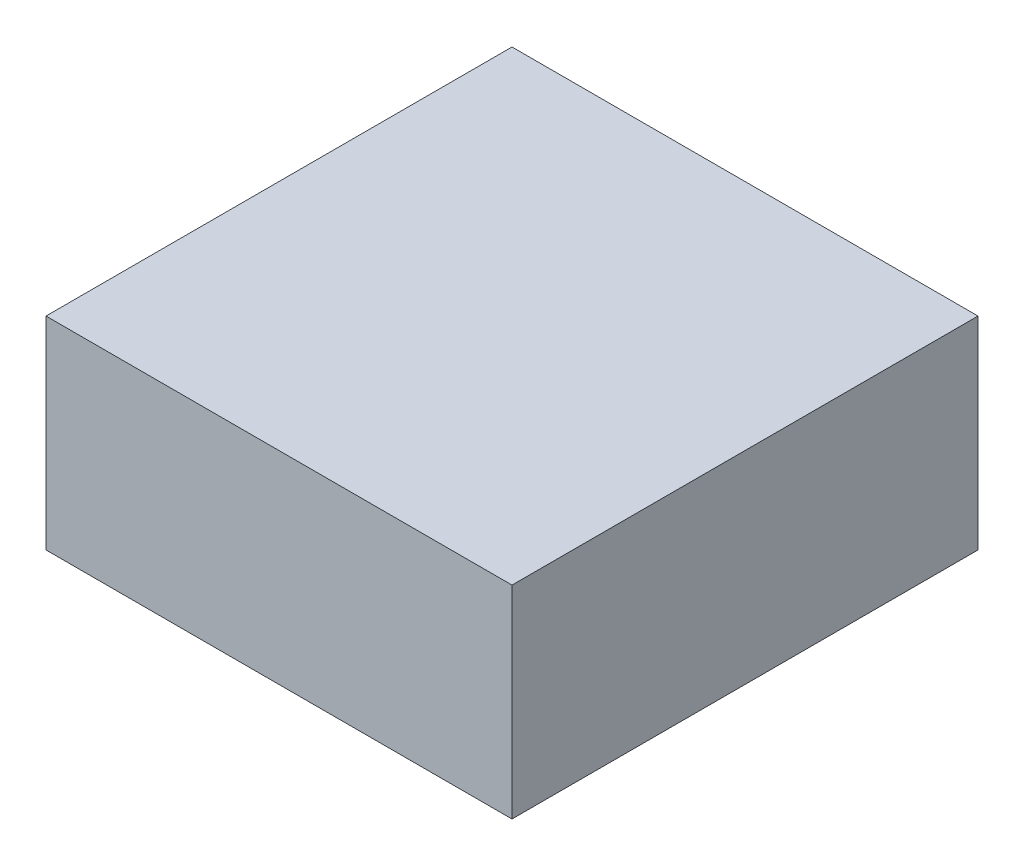
ISO-10303-21;
HEADER;
FILE_DESCRIPTION(('STEP AP214'),'2;1');
FILE_NAME('part.step','',(''),(''),'','','');
FILE_SCHEMA(('AUTOMOTIVE_DESIGN { 1 0 10303 214 1 1 1 1 }'));
ENDSEC;
DATA;
#1=APPLICATION_CONTEXT('core data for automotive mechanical design processes');
#2=APPLICATION_PROTOCOL_DEFINITION('international standard','automotive_design',2000,#1);
#3=PRODUCT_CONTEXT('',#1,'mechanical');
#4=PRODUCT('Part','Part','',(#3));
#5=PRODUCT_RELATED_PRODUCT_CATEGORY('part','',(#4));
#6=PRODUCT_DEFINITION_FORMATION('','',#4);
#7=PRODUCT_DEFINITION_CONTEXT('part definition',#1,'design');
#8=PRODUCT_DEFINITION('design','',#6,#7);
#9=PRODUCT_DEFINITION_SHAPE('','',#8);
#10=(LENGTH_UNIT() NAMED_UNIT(*) SI_UNIT(.MILLI.,.METRE.));
#11=(NAMED_UNIT(*) PLANE_ANGLE_UNIT() SI_UNIT($,.RADIAN.));
#12=(NAMED_UNIT(*) SI_UNIT($,.STERADIAN.) SOLID_ANGLE_UNIT());
#13=UNCERTAINTY_MEASURE_WITH_UNIT(LENGTH_MEASURE(1.E-05),#10,'distance_accuracy_value','');
#14=(GEOMETRIC_REPRESENTATION_CONTEXT(3) GLOBAL_UNCERTAINTY_ASSIGNED_CONTEXT((#13)) GLOBAL_UNIT_ASSIGNED_CONTEXT((#10,
#11,#12)) REPRESENTATION_CONTEXT('',''));
#15=CARTESIAN_POINT('',(0.,0.,0.));
#16=DIRECTION('',(0.,0.,1.));
#17=DIRECTION('',(1.,0.,0.));
#18=AXIS2_PLACEMENT_3D('',#15,#16,#17);
#19=CARTESIAN_POINT('',(115.,100.,-115.));
#20=DIRECTION('',(-1.,0.,0.));
#21=DIRECTION('',(0.,0.,1.));
#22=AXIS2_PLACEMENT_3D('',#19,#20,#21);
#23=PLANE('',#22);
#24=DIRECTION('',(0.,0.,-1.));
#25=VECTOR('',#24,1.);
#26=CARTESIAN_POINT('',(115.,0.,-115.));
#27=LINE('',#26,#25);
#28=CARTESIAN_POINT('',(115.,0.,115.));
#29=VERTEX_POINT('',#28);
#30=CARTESIAN_POINT('',(115.,0.,-115.));
#31=VERTEX_POINT('',#30);
#32=EDGE_CURVE('E107',#29,#31,#27,.T.);
#33=ORIENTED_EDGE('',*,*,#32,.T.);
#34=DIRECTION('',(0.,-1.,0.));
#35=VECTOR('',#34,1.);
#36=CARTESIAN_POINT('',(115.,100.,-115.));
#37=LINE('',#36,#35);
#38=CARTESIAN_POINT('',(115.,100.,-115.));
#39=VERTEX_POINT('',#38);
#40=EDGE_CURVE('E11',#39,#31,#37,.T.);
#41=ORIENTED_EDGE('',*,*,#40,.F.);
#42=DIRECTION('',(0.,0.,-1.));
#43=VECTOR('',#42,1.);
#44=CARTESIAN_POINT('',(115.,100.,-115.));
#45=LINE('',#44,#43);
#46=CARTESIAN_POINT('',(115.,100.,115.));
#47=VERTEX_POINT('',#46);
#48=EDGE_CURVE('E91',#47,#39,#45,.T.);
#49=ORIENTED_EDGE('',*,*,#48,.F.);
#50=DIRECTION('',(0.,-1.,0.));
#51=VECTOR('',#50,1.);
#52=CARTESIAN_POINT('',(115.,100.,115.));
#53=LINE('',#52,#51);
#54=EDGE_CURVE('E103',#47,#29,#53,.T.);
#55=ORIENTED_EDGE('',*,*,#54,.T.);
#56=EDGE_LOOP('',(#33,#41,#49,#55));
#57=FACE_BOUND('',#56,.T.);
#58=ADVANCED_FACE('F39',(#57),#23,.F.);
#59=CARTESIAN_POINT('',(-115.,100.,-115.));
#60=DIRECTION('',(0.,0.,1.));
#61=DIRECTION('',(1.,0.,0.));
#62=AXIS2_PLACEMENT_3D('',#59,#60,#61);
#63=PLANE('',#62);
#64=DIRECTION('',(-1.,0.,0.));
#65=VECTOR('',#64,1.);
#66=CARTESIAN_POINT('',(-115.,0.,-115.));
#67=LINE('',#66,#65);
#68=CARTESIAN_POINT('',(-115.,0.,-115.));
#69=VERTEX_POINT('',#68);
#70=EDGE_CURVE('E96',#31,#69,#67,.T.);
#71=ORIENTED_EDGE('',*,*,#70,.T.);
#72=DIRECTION('',(0.,-1.,0.));
#73=VECTOR('',#72,1.);
#74=CARTESIAN_POINT('',(-115.,100.,-115.));
#75=LINE('',#74,#73);
#76=CARTESIAN_POINT('',(-115.,100.,-115.));
#77=VERTEX_POINT('',#76);
#78=EDGE_CURVE('E48',#77,#69,#75,.T.);
#79=ORIENTED_EDGE('',*,*,#78,.F.);
#80=DIRECTION('',(-1.,0.,0.));
#81=VECTOR('',#80,1.);
#82=CARTESIAN_POINT('',(-115.,100.,-115.));
#83=LINE('',#82,#81);
#84=EDGE_CURVE('E86',#39,#77,#83,.T.);
#85=ORIENTED_EDGE('',*,*,#84,.F.);
#86=ORIENTED_EDGE('',*,*,#40,.T.);
#87=EDGE_LOOP('',(#71,#79,#85,#86));
#88=FACE_BOUND('',#87,.T.);
#89=ADVANCED_FACE('F95',(#88),#63,.F.);
#90=CARTESIAN_POINT('',(-115.,100.,-115.));
#91=DIRECTION('',(1.,0.,0.));
#92=DIRECTION('',(0.,0.,-1.));
#93=AXIS2_PLACEMENT_3D('',#90,#91,#92);
#94=PLANE('',#93);
#95=DIRECTION('',(0.,0.,1.));
#96=VECTOR('',#95,1.);
#97=CARTESIAN_POINT('',(-115.,0.,-115.));
#98=LINE('',#97,#96);
#99=CARTESIAN_POINT('',(-115.,0.,115.));
#100=VERTEX_POINT('',#99);
#101=EDGE_CURVE('E73',#69,#100,#98,.T.);
#102=ORIENTED_EDGE('',*,*,#101,.T.);
#103=DIRECTION('',(0.,-1.,0.));
#104=VECTOR('',#103,1.);
#105=CARTESIAN_POINT('',(-115.,100.,115.));
#106=LINE('',#105,#104);
#107=CARTESIAN_POINT('',(-115.,100.,115.));
#108=VERTEX_POINT('',#107);
#109=EDGE_CURVE('E98',#108,#100,#106,.T.);
#110=ORIENTED_EDGE('',*,*,#109,.F.);
#111=DIRECTION('',(0.,0.,1.));
#112=VECTOR('',#111,1.);
#113=CARTESIAN_POINT('',(-115.,100.,-115.));
#114=LINE('',#113,#112);
#115=EDGE_CURVE('E89',#77,#108,#114,.T.);
#116=ORIENTED_EDGE('',*,*,#115,.F.);
#117=ORIENTED_EDGE('',*,*,#78,.T.);
#118=EDGE_LOOP('',(#102,#110,#116,#117));
#119=FACE_BOUND('',#118,.T.);
#120=ADVANCED_FACE('F99',(#119),#94,.F.);
#121=CARTESIAN_POINT('',(-115.,100.,115.));
#122=DIRECTION('',(0.,0.,-1.));
#123=DIRECTION('',(-1.,0.,0.));
#124=AXIS2_PLACEMENT_3D('',#121,#122,#123);
#125=PLANE('',#124);
#126=DIRECTION('',(1.,0.,0.));
#127=VECTOR('',#126,1.);
#128=CARTESIAN_POINT('',(-115.,0.,115.));
#129=LINE('',#128,#127);
#130=EDGE_CURVE('E79',#100,#29,#129,.T.);
#131=ORIENTED_EDGE('',*,*,#130,.T.);
#132=ORIENTED_EDGE('',*,*,#54,.F.);
#133=DIRECTION('',(1.,0.,0.));
#134=VECTOR('',#133,1.);
#135=CARTESIAN_POINT('',(-115.,100.,115.));
#136=LINE('',#135,#134);
#137=EDGE_CURVE('E56',#108,#47,#136,.T.);
#138=ORIENTED_EDGE('',*,*,#137,.F.);
#139=ORIENTED_EDGE('',*,*,#109,.T.);
#140=EDGE_LOOP('',(#131,#132,#138,#139));
#141=FACE_BOUND('',#140,.T.);
#142=ADVANCED_FACE('F120',(#141),#125,.F.);
#143=CARTESIAN_POINT('',(0.,100.,0.));
#144=DIRECTION('',(0.,1.,0.));
#145=DIRECTION('',(0.,0.,1.));
#146=AXIS2_PLACEMENT_3D('',#143,#144,#145);
#147=PLANE('',#146);
#148=ORIENTED_EDGE('',*,*,#48,.T.);
#149=ORIENTED_EDGE('',*,*,#84,.T.);
#150=ORIENTED_EDGE('',*,*,#115,.T.);
#151=ORIENTED_EDGE('',*,*,#137,.T.);
#152=EDGE_LOOP('',(#148,#149,#150,#151));
#153=FACE_BOUND('',#152,.T.);
#154=ADVANCED_FACE('F87',(#153),#147,.T.);
#155=CARTESIAN_POINT('',(0.,0.,0.));
#156=DIRECTION('',(0.,1.,0.));
#157=DIRECTION('',(0.,0.,1.));
#158=AXIS2_PLACEMENT_3D('',#155,#156,#157);
#159=PLANE('',#158);
#160=ORIENTED_EDGE('',*,*,#32,.F.);
#161=ORIENTED_EDGE('',*,*,#130,.F.);
#162=ORIENTED_EDGE('',*,*,#101,.F.);
#163=ORIENTED_EDGE('',*,*,#70,.F.);
#164=EDGE_LOOP('',(#160,#161,#162,#163));
#165=FACE_BOUND('',#164,.T.);
#166=ADVANCED_FACE('F123',(#165),#159,.F.);
#167=CLOSED_SHELL('',(#58,#89,#120,#142,#154,#166));
#168=MANIFOLD_SOLID_BREP('B2',#167);
#169=ADVANCED_BREP_SHAPE_REPRESENTATION('',(#18,#168),#14);
#170=SHAPE_DEFINITION_REPRESENTATION(#9,#169);
ENDSEC;
END-ISO-10303-21;
